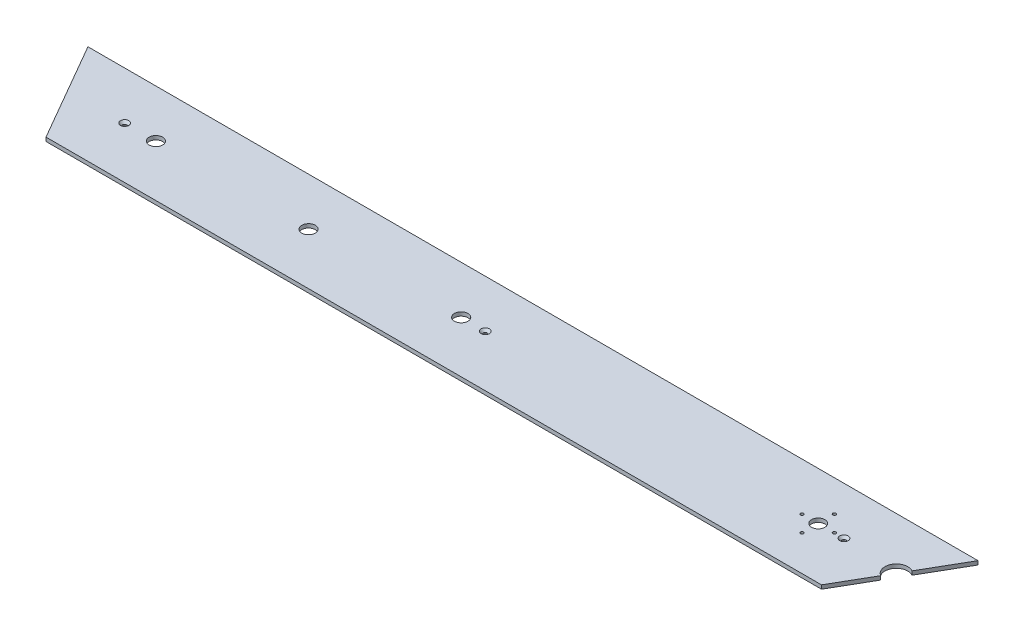
ISO-10303-21;
HEADER;
FILE_DESCRIPTION(('STEP AP214'),'2;1');
FILE_NAME('part.step','',(''),(''),'','','');
FILE_SCHEMA(('AUTOMOTIVE_DESIGN { 1 0 10303 214 1 1 1 1 }'));
ENDSEC;
DATA;
#1=APPLICATION_CONTEXT('core data for automotive mechanical design processes');
#2=APPLICATION_PROTOCOL_DEFINITION('international standard','automotive_design',2000,#1);
#3=PRODUCT_CONTEXT('',#1,'mechanical');
#4=PRODUCT('Part','Part','',(#3));
#5=PRODUCT_RELATED_PRODUCT_CATEGORY('part','',(#4));
#6=PRODUCT_DEFINITION_FORMATION('','',#4);
#7=PRODUCT_DEFINITION_CONTEXT('part definition',#1,'design');
#8=PRODUCT_DEFINITION('design','',#6,#7);
#9=PRODUCT_DEFINITION_SHAPE('','',#8);
#10=(LENGTH_UNIT() NAMED_UNIT(*) SI_UNIT(.MILLI.,.METRE.));
#11=(NAMED_UNIT(*) PLANE_ANGLE_UNIT() SI_UNIT($,.RADIAN.));
#12=(NAMED_UNIT(*) SI_UNIT($,.STERADIAN.) SOLID_ANGLE_UNIT());
#13=UNCERTAINTY_MEASURE_WITH_UNIT(LENGTH_MEASURE(1.E-05),#10,'distance_accuracy_value','');
#14=(GEOMETRIC_REPRESENTATION_CONTEXT(3) GLOBAL_UNCERTAINTY_ASSIGNED_CONTEXT((#13)) GLOBAL_UNIT_ASSIGNED_CONTEXT((#10,
#11,#12)) REPRESENTATION_CONTEXT('',''));
#15=CARTESIAN_POINT('',(0.,0.,0.));
#16=DIRECTION('',(0.,0.,1.));
#17=DIRECTION('',(1.,0.,0.));
#18=AXIS2_PLACEMENT_3D('',#15,#16,#17);
#19=CARTESIAN_POINT('',(-600.075,6.35000000005448,0.));
#20=DIRECTION('',(0.,1.,0.));
#21=DIRECTION('',(-1.,0.,0.));
#22=AXIS2_PLACEMENT_3D('',#19,#20,#21);
#23=CONICAL_SURFACE('',#22,6.97229999997262,0.715584993314902);
#24=CARTESIAN_POINT('',(-600.075,2.20085122883459,0.));
#25=DIRECTION('',(0.,1.,0.));
#26=DIRECTION('',(0.,0.,1.));
#27=AXIS2_PLACEMENT_3D('',#24,#25,#26);
#28=CIRCLE('',#27,3.3655);
#29=CARTESIAN_POINT('',(-600.075,2.20085122883459,3.3655));
#30=VERTEX_POINT('',#29);
#31=EDGE_CURVE('E106',#30,#30,#28,.F.);
#32=ORIENTED_EDGE('',*,*,#31,.T.);
#33=EDGE_LOOP('',(#32));
#34=FACE_BOUND('',#33,.T.);
#35=CARTESIAN_POINT('',(-600.075,6.35000000005448,0.));
#36=DIRECTION('',(0.,1.,0.));
#37=DIRECTION('',(-1.,0.,0.));
#38=AXIS2_PLACEMENT_3D('',#35,#36,#37);
#39=CIRCLE('',#38,6.97229999997262);
#40=CARTESIAN_POINT('',(-607.047299999973,6.35000000005448,0.));
#41=VERTEX_POINT('',#40);
#42=EDGE_CURVE('E19',#41,#41,#39,.F.);
#43=ORIENTED_EDGE('',*,*,#42,.F.);
#44=EDGE_LOOP('',(#43));
#45=FACE_BOUND('',#44,.T.);
#46=ADVANCED_FACE('F16',(#34,#45),#23,.F.);
#47=CARTESIAN_POINT('',(596.9,6.35000000005448,0.));
#48=DIRECTION('',(0.,1.,0.));
#49=DIRECTION('',(-1.,0.,0.));
#50=AXIS2_PLACEMENT_3D('',#47,#48,#49);
#51=CONICAL_SURFACE('',#50,6.97229999997262,0.715584993314902);
#52=CARTESIAN_POINT('',(596.9,2.20085122883459,0.));
#53=DIRECTION('',(0.,1.,0.));
#54=DIRECTION('',(0.,0.,1.));
#55=AXIS2_PLACEMENT_3D('',#52,#53,#54);
#56=CIRCLE('',#55,3.3655);
#57=CARTESIAN_POINT('',(596.9,2.20085122883459,3.3655));
#58=VERTEX_POINT('',#57);
#59=EDGE_CURVE('E102',#58,#58,#56,.F.);
#60=ORIENTED_EDGE('',*,*,#59,.T.);
#61=EDGE_LOOP('',(#60));
#62=FACE_BOUND('',#61,.T.);
#63=CARTESIAN_POINT('',(596.9,6.35000000005448,0.));
#64=DIRECTION('',(0.,1.,0.));
#65=DIRECTION('',(-1.,0.,0.));
#66=AXIS2_PLACEMENT_3D('',#63,#64,#65);
#67=CIRCLE('',#66,6.97229999997262);
#68=CARTESIAN_POINT('',(589.927700000027,6.35000000005448,0.));
#69=VERTEX_POINT('',#68);
#70=EDGE_CURVE('E182',#69,#69,#67,.F.);
#71=ORIENTED_EDGE('',*,*,#70,.F.);
#72=EDGE_LOOP('',(#71));
#73=FACE_BOUND('',#72,.T.);
#74=ADVANCED_FACE('F192',(#62,#73),#51,.F.);
#75=CARTESIAN_POINT('',(0.,6.35,0.));
#76=DIRECTION('',(0.,1.,0.));
#77=DIRECTION('',(0.,0.,1.));
#78=AXIS2_PLACEMENT_3D('',#75,#76,#77);
#79=PLANE('',#78);
#80=CARTESIAN_POINT('',(-548.096896592432,6.35,0.));
#81=DIRECTION('',(0.,1.,0.));
#82=DIRECTION('',(0.,0.,1.));
#83=AXIS2_PLACEMENT_3D('',#80,#81,#82);
#84=CIRCLE('',#83,11.303);
#85=CARTESIAN_POINT('',(-548.096896592432,6.35,11.303));
#86=VERTEX_POINT('',#85);
#87=EDGE_CURVE('E177',#86,#86,#84,.F.);
#88=ORIENTED_EDGE('',*,*,#87,.T.);
#89=EDGE_LOOP('',(#88));
#90=FACE_BOUND('',#89,.T.);
#91=CARTESIAN_POINT('',(581.025,6.35,0.));
#92=DIRECTION('',(0.,1.,0.));
#93=DIRECTION('',(0.,0.,1.));
#94=AXIS2_PLACEMENT_3D('',#91,#92,#93);
#95=CIRCLE('',#94,2.6162);
#96=CARTESIAN_POINT('',(581.025,6.35,2.6162));
#97=VERTEX_POINT('',#96);
#98=EDGE_CURVE('E101',#97,#97,#95,.F.);
#99=ORIENTED_EDGE('',*,*,#98,.T.);
#100=EDGE_LOOP('',(#99));
#101=FACE_BOUND('',#100,.T.);
#102=CARTESIAN_POINT('',(527.05,6.35,0.));
#103=DIRECTION('',(0.,1.,0.));
#104=DIRECTION('',(0.,0.,1.));
#105=AXIS2_PLACEMENT_3D('',#102,#103,#104);
#106=CIRCLE('',#105,2.6162);
#107=CARTESIAN_POINT('',(527.05,6.35,2.6162));
#108=VERTEX_POINT('',#107);
#109=EDGE_CURVE('E161',#108,#108,#106,.F.);
#110=ORIENTED_EDGE('',*,*,#109,.T.);
#111=EDGE_LOOP('',(#110));
#112=FACE_BOUND('',#111,.T.);
#113=CARTESIAN_POINT('',(554.0375,6.35,27.0002));
#114=DIRECTION('',(0.,1.,0.));
#115=DIRECTION('',(0.,0.,1.));
#116=AXIS2_PLACEMENT_3D('',#113,#114,#115);
#117=CIRCLE('',#116,2.6162);
#118=CARTESIAN_POINT('',(554.0375,6.35,29.6164));
#119=VERTEX_POINT('',#118);
#120=EDGE_CURVE('E164',#119,#119,#117,.F.);
#121=ORIENTED_EDGE('',*,*,#120,.T.);
#122=EDGE_LOOP('',(#121));
#123=FACE_BOUND('',#122,.T.);
#124=CARTESIAN_POINT('',(554.0375,6.35,-26.9875));
#125=DIRECTION('',(0.,1.,0.));
#126=DIRECTION('',(0.,0.,1.));
#127=AXIS2_PLACEMENT_3D('',#124,#125,#126);
#128=CIRCLE('',#127,2.6162);
#129=CARTESIAN_POINT('',(554.0375,6.35,-24.3713));
#130=VERTEX_POINT('',#129);
#131=EDGE_CURVE('E167',#130,#130,#128,.F.);
#132=ORIENTED_EDGE('',*,*,#131,.T.);
#133=EDGE_LOOP('',(#132));
#134=FACE_BOUND('',#133,.T.);
#135=CARTESIAN_POINT('',(554.0375,6.35,0.));
#136=DIRECTION('',(0.,1.,0.));
#137=DIRECTION('',(0.,0.,1.));
#138=AXIS2_PLACEMENT_3D('',#135,#136,#137);
#139=CIRCLE('',#138,11.1125);
#140=CARTESIAN_POINT('',(554.0375,6.35,11.1125));
#141=VERTEX_POINT('',#140);
#142=EDGE_CURVE('E105',#141,#141,#139,.F.);
#143=ORIENTED_EDGE('',*,*,#142,.T.);
#144=EDGE_LOOP('',(#143));
#145=FACE_BOUND('',#144,.T.);
#146=ORIENTED_EDGE('',*,*,#70,.T.);
#147=EDGE_LOOP('',(#146));
#148=FACE_BOUND('',#147,.T.);
#149=ORIENTED_EDGE('',*,*,#42,.T.);
#150=EDGE_LOOP('',(#149));
#151=FACE_BOUND('',#150,.T.);
#152=CARTESIAN_POINT('',(0.,6.35000000005448,0.));
#153=DIRECTION('',(0.,1.,0.));
#154=DIRECTION('',(-1.,0.,0.));
#155=AXIS2_PLACEMENT_3D('',#152,#153,#154);
#156=CIRCLE('',#155,6.97229999997262);
#157=CARTESIAN_POINT('',(-6.97229999997262,6.35000000005448,0.));
#158=VERTEX_POINT('',#157);
#159=EDGE_CURVE('E87',#158,#158,#156,.F.);
#160=ORIENTED_EDGE('',*,*,#159,.T.);
#161=EDGE_LOOP('',(#160));
#162=FACE_BOUND('',#161,.T.);
#163=CARTESIAN_POINT('',(-40.096896592432,6.35,0.));
#164=DIRECTION('',(0.,1.,0.));
#165=DIRECTION('',(0.,0.,1.));
#166=AXIS2_PLACEMENT_3D('',#163,#164,#165);
#167=CIRCLE('',#166,11.303);
#168=CARTESIAN_POINT('',(-40.096896592432,6.35,11.303));
#169=VERTEX_POINT('',#168);
#170=EDGE_CURVE('E109',#169,#169,#167,.F.);
#171=ORIENTED_EDGE('',*,*,#170,.T.);
#172=EDGE_LOOP('',(#171));
#173=FACE_BOUND('',#172,.T.);
#174=CARTESIAN_POINT('',(-294.096896592432,6.35,0.));
#175=DIRECTION('',(0.,1.,0.));
#176=DIRECTION('',(0.,0.,1.));
#177=AXIS2_PLACEMENT_3D('',#174,#175,#176);
#178=CIRCLE('',#177,11.303);
#179=CARTESIAN_POINT('',(-294.096896592432,6.35,11.303));
#180=VERTEX_POINT('',#179);
#181=EDGE_CURVE('E174',#180,#180,#178,.F.);
#182=ORIENTED_EDGE('',*,*,#181,.T.);
#183=EDGE_LOOP('',(#182));
#184=FACE_BOUND('',#183,.T.);
#185=DIRECTION('',(0.500000000000017,0.,-0.866025403784429));
#186=VECTOR('',#185,1.);
#187=CARTESIAN_POINT('',(645.263144766024,6.35,85.725));
#188=LINE('',#187,#186);
#189=CARTESIAN_POINT('',(681.345351930393,6.35,23.2287839420901));
#190=VERTEX_POINT('',#189);
#191=CARTESIAN_POINT('',(645.263144766024,6.35,85.725));
#192=VERTEX_POINT('',#191);
#193=EDGE_CURVE('E83',#190,#192,#188,.F.);
#194=ORIENTED_EDGE('',*,*,#193,.F.);
#195=CARTESIAN_POINT('',(690.870351930396,6.35,6.731));
#196=DIRECTION('',(0.,1.,0.));
#197=DIRECTION('',(0.,0.,1.));
#198=AXIS2_PLACEMENT_3D('',#195,#196,#197);
#199=CIRCLE('',#198,19.05);
#200=CARTESIAN_POINT('',(700.395351930393,6.35,-9.76678394209511));
#201=VERTEX_POINT('',#200);
#202=EDGE_CURVE('E77',#190,#201,#199,.F.);
#203=ORIENTED_EDGE('',*,*,#202,.T.);
#204=DIRECTION('',(0.500000000000017,0.,-0.866025403784429));
#205=VECTOR('',#204,1.);
#206=CARTESIAN_POINT('',(645.263144766024,6.35,85.725));
#207=LINE('',#206,#205);
#208=CARTESIAN_POINT('',(740.583674209374,6.35,-79.3750000000266));
#209=VERTEX_POINT('',#208);
#210=EDGE_CURVE('E67',#209,#201,#207,.F.);
#211=ORIENTED_EDGE('',*,*,#210,.F.);
#212=DIRECTION('',(-1.,0.,0.));
#213=VECTOR('',#212,1.);
#214=CARTESIAN_POINT('',(740.58367420942,6.35,-79.375));
#215=LINE('',#214,#213);
#216=CARTESIAN_POINT('',(-740.58367420942,6.35,-79.375));
#217=VERTEX_POINT('',#216);
#218=EDGE_CURVE('E91',#217,#209,#215,.F.);
#219=ORIENTED_EDGE('',*,*,#218,.F.);
#220=DIRECTION('',(0.500000000000017,0.,0.866025403784429));
#221=VECTOR('',#220,1.);
#222=CARTESIAN_POINT('',(-740.58367420942,6.35,-79.375));
#223=LINE('',#222,#221);
#224=CARTESIAN_POINT('',(-645.26314476607,6.35,85.7250000000266));
#225=VERTEX_POINT('',#224);
#226=EDGE_CURVE('E119',#225,#217,#223,.F.);
#227=ORIENTED_EDGE('',*,*,#226,.F.);
#228=DIRECTION('',(1.,0.,0.));
#229=VECTOR('',#228,1.);
#230=CARTESIAN_POINT('',(-645.263144766024,6.35,85.725));
#231=LINE('',#230,#229);
#232=EDGE_CURVE('E114',#192,#225,#231,.F.);
#233=ORIENTED_EDGE('',*,*,#232,.F.);
#234=EDGE_LOOP('',(#194,#203,#211,#219,#227,#233));
#235=FACE_BOUND('',#234,.T.);
#236=ADVANCED_FACE('F81',(#90,#101,#112,#123,#134,#145,#148,#151,#162,#173,#184,#235),#79,.T.);
#237=CARTESIAN_POINT('',(0.,6.35000000005448,0.));
#238=DIRECTION('',(0.,1.,0.));
#239=DIRECTION('',(-1.,0.,0.));
#240=AXIS2_PLACEMENT_3D('',#237,#238,#239);
#241=CONICAL_SURFACE('',#240,6.97229999997262,0.715584993314902);
#242=CARTESIAN_POINT('',(0.,2.20085122883459,0.));
#243=DIRECTION('',(0.,1.,0.));
#244=DIRECTION('',(0.,0.,1.));
#245=AXIS2_PLACEMENT_3D('',#242,#243,#244);
#246=CIRCLE('',#245,3.3655);
#247=CARTESIAN_POINT('',(0.,2.20085122883459,3.3655));
#248=VERTEX_POINT('',#247);
#249=EDGE_CURVE('E98',#248,#248,#246,.F.);
#250=ORIENTED_EDGE('',*,*,#249,.T.);
#251=EDGE_LOOP('',(#250));
#252=FACE_BOUND('',#251,.T.);
#253=ORIENTED_EDGE('',*,*,#159,.F.);
#254=EDGE_LOOP('',(#253));
#255=FACE_BOUND('',#254,.T.);
#256=ADVANCED_FACE('F271',(#252,#255),#241,.F.);
#257=CARTESIAN_POINT('',(690.870351930396,6.35,6.731));
#258=DIRECTION('',(0.,1.,0.));
#259=DIRECTION('',(0.,0.,1.));
#260=AXIS2_PLACEMENT_3D('',#257,#258,#259);
#261=CYLINDRICAL_SURFACE('',#260,19.05);
#262=ORIENTED_EDGE('',*,*,#202,.F.);
#263=DIRECTION('',(0.,1.,0.));
#264=VECTOR('',#263,1.);
#265=CARTESIAN_POINT('',(681.345351930394,0.,23.2287839420889));
#266=LINE('',#265,#264);
#267=CARTESIAN_POINT('',(681.345351930394,0.,23.2287839420908));
#268=VERTEX_POINT('',#267);
#269=EDGE_CURVE('E179',#268,#190,#266,.T.);
#270=ORIENTED_EDGE('',*,*,#269,.F.);
#271=CARTESIAN_POINT('',(690.870351930396,0.,6.731));
#272=DIRECTION('',(0.,1.,0.));
#273=DIRECTION('',(0.,0.,1.));
#274=AXIS2_PLACEMENT_3D('',#271,#272,#273);
#275=CIRCLE('',#274,19.05);
#276=CARTESIAN_POINT('',(700.395351930394,0.,-9.76678394209411));
#277=VERTEX_POINT('',#276);
#278=EDGE_CURVE('E90',#268,#277,#275,.F.);
#279=ORIENTED_EDGE('',*,*,#278,.T.);
#280=DIRECTION('',(0.,1.,0.));
#281=VECTOR('',#280,1.);
#282=CARTESIAN_POINT('',(700.395351930393,0.,-9.76678394209485));
#283=LINE('',#282,#281);
#284=EDGE_CURVE('E72',#201,#277,#283,.F.);
#285=ORIENTED_EDGE('',*,*,#284,.F.);
#286=EDGE_LOOP('',(#262,#270,#279,#285));
#287=FACE_BOUND('',#286,.T.);
#288=ADVANCED_FACE('F89',(#287),#261,.F.);
#289=CARTESIAN_POINT('',(645.263144766024,0.,85.725));
#290=DIRECTION('',(0.866025403784429,0.,0.500000000000017));
#291=DIRECTION('',(0.500000000000017,0.,-0.866025403784429));
#292=AXIS2_PLACEMENT_3D('',#289,#290,#291);
#293=PLANE('',#292);
#294=ORIENTED_EDGE('',*,*,#210,.T.);
#295=ORIENTED_EDGE('',*,*,#284,.T.);
#296=DIRECTION('',(0.500000000001559,0.,-0.866025403783539));
#297=VECTOR('',#296,1.);
#298=CARTESIAN_POINT('',(700.395351930396,0.,-9.76678394209282));
#299=LINE('',#298,#297);
#300=CARTESIAN_POINT('',(740.58367420942,0.,-79.3750000000169));
#301=VERTEX_POINT('',#300);
#302=EDGE_CURVE('E158',#277,#301,#299,.T.);
#303=ORIENTED_EDGE('',*,*,#302,.T.);
#304=DIRECTION('',(0.,1.,0.));
#305=VECTOR('',#304,1.);
#306=CARTESIAN_POINT('',(740.58367420942,0.,-79.375));
#307=LINE('',#306,#305);
#308=EDGE_CURVE('E74',#209,#301,#307,.F.);
#309=ORIENTED_EDGE('',*,*,#308,.F.);
#310=EDGE_LOOP('',(#294,#295,#303,#309));
#311=FACE_BOUND('',#310,.T.);
#312=ADVANCED_FACE('F69',(#311),#293,.T.);
#313=CARTESIAN_POINT('',(740.58367420942,0.,-79.375));
#314=DIRECTION('',(0.,0.,-1.));
#315=DIRECTION('',(-1.,0.,0.));
#316=AXIS2_PLACEMENT_3D('',#313,#314,#315);
#317=PLANE('',#316);
#318=ORIENTED_EDGE('',*,*,#308,.T.);
#319=DIRECTION('',(1.,0.,0.));
#320=VECTOR('',#319,1.);
#321=CARTESIAN_POINT('',(0.,0.,-79.3750000000254));
#322=LINE('',#321,#320);
#323=CARTESIAN_POINT('',(-740.58367420943,0.,-79.3750000000169));
#324=VERTEX_POINT('',#323);
#325=EDGE_CURVE('E315',#301,#324,#322,.F.);
#326=ORIENTED_EDGE('',*,*,#325,.T.);
#327=DIRECTION('',(0.,1.,0.));
#328=VECTOR('',#327,1.);
#329=CARTESIAN_POINT('',(-740.58367420942,0.,-79.375));
#330=LINE('',#329,#328);
#331=EDGE_CURVE('E116',#217,#324,#330,.F.);
#332=ORIENTED_EDGE('',*,*,#331,.F.);
#333=ORIENTED_EDGE('',*,*,#218,.T.);
#334=EDGE_LOOP('',(#318,#326,#332,#333));
#335=FACE_BOUND('',#334,.T.);
#336=ADVANCED_FACE('F262',(#335),#317,.T.);
#337=CARTESIAN_POINT('',(-740.58367420942,0.,-79.375));
#338=DIRECTION('',(-0.866025403784429,0.,0.500000000000017));
#339=DIRECTION('',(0.500000000000017,0.,0.866025403784429));
#340=AXIS2_PLACEMENT_3D('',#337,#338,#339);
#341=PLANE('',#340);
#342=ORIENTED_EDGE('',*,*,#331,.T.);
#343=DIRECTION('',(0.500000000000685,0.,0.866025403784043));
#344=VECTOR('',#343,1.);
#345=CARTESIAN_POINT('',(-740.58367420942,0.,-79.375));
#346=LINE('',#345,#344);
#347=CARTESIAN_POINT('',(-645.263144766024,0.,85.7250000000169));
#348=VERTEX_POINT('',#347);
#349=EDGE_CURVE('E310',#324,#348,#346,.T.);
#350=ORIENTED_EDGE('',*,*,#349,.T.);
#351=DIRECTION('',(0.,1.,0.));
#352=VECTOR('',#351,1.);
#353=CARTESIAN_POINT('',(-645.263144766024,0.,85.725));
#354=LINE('',#353,#352);
#355=EDGE_CURVE('E111',#225,#348,#354,.F.);
#356=ORIENTED_EDGE('',*,*,#355,.F.);
#357=ORIENTED_EDGE('',*,*,#226,.T.);
#358=EDGE_LOOP('',(#342,#350,#356,#357));
#359=FACE_BOUND('',#358,.T.);
#360=ADVANCED_FACE('F258',(#359),#341,.T.);
#361=CARTESIAN_POINT('',(-645.263144766024,0.,85.725));
#362=DIRECTION('',(0.,0.,1.));
#363=DIRECTION('',(1.,0.,0.));
#364=AXIS2_PLACEMENT_3D('',#361,#362,#363);
#365=PLANE('',#364);
#366=ORIENTED_EDGE('',*,*,#355,.T.);
#367=DIRECTION('',(1.,0.,0.));
#368=VECTOR('',#367,1.);
#369=CARTESIAN_POINT('',(0.,0.,85.7250000000254));
#370=LINE('',#369,#368);
#371=CARTESIAN_POINT('',(645.263144766014,0.,85.7250000000169));
#372=VERTEX_POINT('',#371);
#373=EDGE_CURVE('E307',#348,#372,#370,.T.);
#374=ORIENTED_EDGE('',*,*,#373,.T.);
#375=DIRECTION('',(0.,1.,0.));
#376=VECTOR('',#375,1.);
#377=CARTESIAN_POINT('',(645.263144766024,0.,85.725));
#378=LINE('',#377,#376);
#379=EDGE_CURVE('E34',#192,#372,#378,.F.);
#380=ORIENTED_EDGE('',*,*,#379,.F.);
#381=ORIENTED_EDGE('',*,*,#232,.T.);
#382=EDGE_LOOP('',(#366,#374,#380,#381));
#383=FACE_BOUND('',#382,.T.);
#384=ADVANCED_FACE('F255',(#383),#365,.T.);
#385=CARTESIAN_POINT('',(645.263144766024,0.,85.725));
#386=DIRECTION('',(0.866025403784429,0.,0.500000000000017));
#387=DIRECTION('',(0.500000000000017,0.,-0.866025403784429));
#388=AXIS2_PLACEMENT_3D('',#385,#386,#387);
#389=PLANE('',#388);
#390=DIRECTION('',(0.500000000000049,0.,-0.86602540378441));
#391=VECTOR('',#390,1.);
#392=CARTESIAN_POINT('',(645.263144766024,0.,85.725));
#393=LINE('',#392,#391);
#394=EDGE_CURVE('E156',#372,#268,#393,.T.);
#395=ORIENTED_EDGE('',*,*,#394,.T.);
#396=ORIENTED_EDGE('',*,*,#269,.T.);
#397=ORIENTED_EDGE('',*,*,#193,.T.);
#398=ORIENTED_EDGE('',*,*,#379,.T.);
#399=EDGE_LOOP('',(#395,#396,#397,#398));
#400=FACE_BOUND('',#399,.T.);
#401=ADVANCED_FACE('F251',(#400),#389,.T.);
#402=CARTESIAN_POINT('',(-548.096896592432,6.35,0.));
#403=DIRECTION('',(0.,1.,0.));
#404=DIRECTION('',(0.,0.,1.));
#405=AXIS2_PLACEMENT_3D('',#402,#403,#404);
#406=CYLINDRICAL_SURFACE('',#405,11.303);
#407=ORIENTED_EDGE('',*,*,#87,.F.);
#408=EDGE_LOOP('',(#407));
#409=FACE_BOUND('',#408,.T.);
#410=CARTESIAN_POINT('',(-548.096896592432,0.,0.));
#411=DIRECTION('',(0.,1.,0.));
#412=DIRECTION('',(0.,0.,1.));
#413=AXIS2_PLACEMENT_3D('',#410,#411,#412);
#414=CIRCLE('',#413,11.303);
#415=CARTESIAN_POINT('',(-548.096896592432,0.,11.303));
#416=VERTEX_POINT('',#415);
#417=EDGE_CURVE('E153',#416,#416,#414,.F.);
#418=ORIENTED_EDGE('',*,*,#417,.T.);
#419=EDGE_LOOP('',(#418));
#420=FACE_BOUND('',#419,.T.);
#421=ADVANCED_FACE('F247',(#409,#420),#406,.F.);
#422=CARTESIAN_POINT('',(-294.096896592432,6.35,0.));
#423=DIRECTION('',(0.,1.,0.));
#424=DIRECTION('',(0.,0.,1.));
#425=AXIS2_PLACEMENT_3D('',#422,#423,#424);
#426=CYLINDRICAL_SURFACE('',#425,11.303);
#427=ORIENTED_EDGE('',*,*,#181,.F.);
#428=EDGE_LOOP('',(#427));
#429=FACE_BOUND('',#428,.T.);
#430=CARTESIAN_POINT('',(-294.096896592432,0.,0.));
#431=DIRECTION('',(0.,1.,0.));
#432=DIRECTION('',(0.,0.,1.));
#433=AXIS2_PLACEMENT_3D('',#430,#431,#432);
#434=CIRCLE('',#433,11.303);
#435=CARTESIAN_POINT('',(-294.096896592432,0.,11.303));
#436=VERTEX_POINT('',#435);
#437=EDGE_CURVE('E150',#436,#436,#434,.F.);
#438=ORIENTED_EDGE('',*,*,#437,.T.);
#439=EDGE_LOOP('',(#438));
#440=FACE_BOUND('',#439,.T.);
#441=ADVANCED_FACE('F243',(#429,#440),#426,.F.);
#442=CARTESIAN_POINT('',(-40.096896592432,6.35,0.));
#443=DIRECTION('',(0.,1.,0.));
#444=DIRECTION('',(0.,0.,1.));
#445=AXIS2_PLACEMENT_3D('',#442,#443,#444);
#446=CYLINDRICAL_SURFACE('',#445,11.303);
#447=ORIENTED_EDGE('',*,*,#170,.F.);
#448=EDGE_LOOP('',(#447));
#449=FACE_BOUND('',#448,.T.);
#450=CARTESIAN_POINT('',(-40.096896592432,0.,0.));
#451=DIRECTION('',(0.,1.,0.));
#452=DIRECTION('',(0.,0.,1.));
#453=AXIS2_PLACEMENT_3D('',#450,#451,#452);
#454=CIRCLE('',#453,11.303);
#455=CARTESIAN_POINT('',(-40.096896592432,0.,11.303));
#456=VERTEX_POINT('',#455);
#457=EDGE_CURVE('E147',#456,#456,#454,.F.);
#458=ORIENTED_EDGE('',*,*,#457,.T.);
#459=EDGE_LOOP('',(#458));
#460=FACE_BOUND('',#459,.T.);
#461=ADVANCED_FACE('F239',(#449,#460),#446,.F.);
#462=CARTESIAN_POINT('',(-600.075,6.35,0.));
#463=DIRECTION('',(0.,1.,0.));
#464=DIRECTION('',(0.,0.,1.));
#465=AXIS2_PLACEMENT_3D('',#462,#463,#464);
#466=CYLINDRICAL_SURFACE('',#465,3.3655);
#467=CARTESIAN_POINT('',(-600.075,0.,0.));
#468=DIRECTION('',(0.,1.,0.));
#469=DIRECTION('',(0.,0.,1.));
#470=AXIS2_PLACEMENT_3D('',#467,#468,#469);
#471=CIRCLE('',#470,3.3655);
#472=CARTESIAN_POINT('',(-600.075,0.,3.3655));
#473=VERTEX_POINT('',#472);
#474=EDGE_CURVE('E144',#473,#473,#471,.F.);
#475=ORIENTED_EDGE('',*,*,#474,.T.);
#476=EDGE_LOOP('',(#475));
#477=FACE_BOUND('',#476,.T.);
#478=ORIENTED_EDGE('',*,*,#31,.F.);
#479=EDGE_LOOP('',(#478));
#480=FACE_BOUND('',#479,.T.);
#481=ADVANCED_FACE('F235',(#477,#480),#466,.F.);
#482=CARTESIAN_POINT('',(596.9,6.35,0.));
#483=DIRECTION('',(0.,1.,0.));
#484=DIRECTION('',(0.,0.,1.));
#485=AXIS2_PLACEMENT_3D('',#482,#483,#484);
#486=CYLINDRICAL_SURFACE('',#485,3.3655);
#487=CARTESIAN_POINT('',(596.9,0.,0.));
#488=DIRECTION('',(0.,1.,0.));
#489=DIRECTION('',(0.,0.,1.));
#490=AXIS2_PLACEMENT_3D('',#487,#488,#489);
#491=CIRCLE('',#490,3.3655);
#492=CARTESIAN_POINT('',(596.9,0.,3.3655));
#493=VERTEX_POINT('',#492);
#494=EDGE_CURVE('E141',#493,#493,#491,.F.);
#495=ORIENTED_EDGE('',*,*,#494,.T.);
#496=EDGE_LOOP('',(#495));
#497=FACE_BOUND('',#496,.T.);
#498=ORIENTED_EDGE('',*,*,#59,.F.);
#499=EDGE_LOOP('',(#498));
#500=FACE_BOUND('',#499,.T.);
#501=ADVANCED_FACE('F231',(#497,#500),#486,.F.);
#502=CARTESIAN_POINT('',(554.0375,6.35,0.));
#503=DIRECTION('',(0.,1.,0.));
#504=DIRECTION('',(0.,0.,1.));
#505=AXIS2_PLACEMENT_3D('',#502,#503,#504);
#506=CYLINDRICAL_SURFACE('',#505,11.1125);
#507=ORIENTED_EDGE('',*,*,#142,.F.);
#508=EDGE_LOOP('',(#507));
#509=FACE_BOUND('',#508,.T.);
#510=CARTESIAN_POINT('',(554.0375,0.,0.));
#511=DIRECTION('',(0.,1.,0.));
#512=DIRECTION('',(0.,0.,1.));
#513=AXIS2_PLACEMENT_3D('',#510,#511,#512);
#514=CIRCLE('',#513,11.1125);
#515=CARTESIAN_POINT('',(554.0375,0.,11.1125));
#516=VERTEX_POINT('',#515);
#517=EDGE_CURVE('E138',#516,#516,#514,.F.);
#518=ORIENTED_EDGE('',*,*,#517,.T.);
#519=EDGE_LOOP('',(#518));
#520=FACE_BOUND('',#519,.T.);
#521=ADVANCED_FACE('F227',(#509,#520),#506,.F.);
#522=CARTESIAN_POINT('',(554.0375,6.35,-26.9875));
#523=DIRECTION('',(0.,1.,0.));
#524=DIRECTION('',(0.,0.,1.));
#525=AXIS2_PLACEMENT_3D('',#522,#523,#524);
#526=CYLINDRICAL_SURFACE('',#525,2.6162);
#527=ORIENTED_EDGE('',*,*,#131,.F.);
#528=EDGE_LOOP('',(#527));
#529=FACE_BOUND('',#528,.T.);
#530=CARTESIAN_POINT('',(554.0375,0.,-26.9875));
#531=DIRECTION('',(0.,1.,0.));
#532=DIRECTION('',(0.,0.,1.));
#533=AXIS2_PLACEMENT_3D('',#530,#531,#532);
#534=CIRCLE('',#533,2.6162);
#535=CARTESIAN_POINT('',(554.0375,0.,-24.3713));
#536=VERTEX_POINT('',#535);
#537=EDGE_CURVE('E135',#536,#536,#534,.F.);
#538=ORIENTED_EDGE('',*,*,#537,.T.);
#539=EDGE_LOOP('',(#538));
#540=FACE_BOUND('',#539,.T.);
#541=ADVANCED_FACE('F223',(#529,#540),#526,.F.);
#542=CARTESIAN_POINT('',(554.0375,6.35,27.0002));
#543=DIRECTION('',(0.,1.,0.));
#544=DIRECTION('',(0.,0.,1.));
#545=AXIS2_PLACEMENT_3D('',#542,#543,#544);
#546=CYLINDRICAL_SURFACE('',#545,2.6162);
#547=ORIENTED_EDGE('',*,*,#120,.F.);
#548=EDGE_LOOP('',(#547));
#549=FACE_BOUND('',#548,.T.);
#550=CARTESIAN_POINT('',(554.0375,0.,27.0002));
#551=DIRECTION('',(0.,1.,0.));
#552=DIRECTION('',(0.,0.,1.));
#553=AXIS2_PLACEMENT_3D('',#550,#551,#552);
#554=CIRCLE('',#553,2.6162);
#555=CARTESIAN_POINT('',(554.0375,0.,29.6164));
#556=VERTEX_POINT('',#555);
#557=EDGE_CURVE('E132',#556,#556,#554,.F.);
#558=ORIENTED_EDGE('',*,*,#557,.T.);
#559=EDGE_LOOP('',(#558));
#560=FACE_BOUND('',#559,.T.);
#561=ADVANCED_FACE('F219',(#549,#560),#546,.F.);
#562=CARTESIAN_POINT('',(527.05,6.35,0.));
#563=DIRECTION('',(0.,1.,0.));
#564=DIRECTION('',(0.,0.,1.));
#565=AXIS2_PLACEMENT_3D('',#562,#563,#564);
#566=CYLINDRICAL_SURFACE('',#565,2.6162);
#567=ORIENTED_EDGE('',*,*,#109,.F.);
#568=EDGE_LOOP('',(#567));
#569=FACE_BOUND('',#568,.T.);
#570=CARTESIAN_POINT('',(527.05,0.,0.));
#571=DIRECTION('',(0.,1.,0.));
#572=DIRECTION('',(0.,0.,1.));
#573=AXIS2_PLACEMENT_3D('',#570,#571,#572);
#574=CIRCLE('',#573,2.6162);
#575=CARTESIAN_POINT('',(527.05,0.,2.6162));
#576=VERTEX_POINT('',#575);
#577=EDGE_CURVE('E129',#576,#576,#574,.F.);
#578=ORIENTED_EDGE('',*,*,#577,.T.);
#579=EDGE_LOOP('',(#578));
#580=FACE_BOUND('',#579,.T.);
#581=ADVANCED_FACE('F215',(#569,#580),#566,.F.);
#582=CARTESIAN_POINT('',(581.025,6.35,0.));
#583=DIRECTION('',(0.,1.,0.));
#584=DIRECTION('',(0.,0.,1.));
#585=AXIS2_PLACEMENT_3D('',#582,#583,#584);
#586=CYLINDRICAL_SURFACE('',#585,2.6162);
#587=ORIENTED_EDGE('',*,*,#98,.F.);
#588=EDGE_LOOP('',(#587));
#589=FACE_BOUND('',#588,.T.);
#590=CARTESIAN_POINT('',(581.025,0.,0.));
#591=DIRECTION('',(0.,1.,0.));
#592=DIRECTION('',(0.,0.,1.));
#593=AXIS2_PLACEMENT_3D('',#590,#591,#592);
#594=CIRCLE('',#593,2.6162);
#595=CARTESIAN_POINT('',(581.025,0.,2.6162));
#596=VERTEX_POINT('',#595);
#597=EDGE_CURVE('E25',#596,#596,#594,.F.);
#598=ORIENTED_EDGE('',*,*,#597,.T.);
#599=EDGE_LOOP('',(#598));
#600=FACE_BOUND('',#599,.T.);
#601=ADVANCED_FACE('F207',(#589,#600),#586,.F.);
#602=CARTESIAN_POINT('',(0.,6.35,0.));
#603=DIRECTION('',(0.,1.,0.));
#604=DIRECTION('',(0.,0.,1.));
#605=AXIS2_PLACEMENT_3D('',#602,#603,#604);
#606=CYLINDRICAL_SURFACE('',#605,3.3655);
#607=CARTESIAN_POINT('',(0.,0.,0.));
#608=DIRECTION('',(0.,1.,0.));
#609=DIRECTION('',(0.,0.,1.));
#610=AXIS2_PLACEMENT_3D('',#607,#608,#609);
#611=CIRCLE('',#610,3.3655);
#612=CARTESIAN_POINT('',(0.,0.,3.3655));
#613=VERTEX_POINT('',#612);
#614=EDGE_CURVE('E11',#613,#613,#611,.F.);
#615=ORIENTED_EDGE('',*,*,#614,.T.);
#616=EDGE_LOOP('',(#615));
#617=FACE_BOUND('',#616,.T.);
#618=ORIENTED_EDGE('',*,*,#249,.F.);
#619=EDGE_LOOP('',(#618));
#620=FACE_BOUND('',#619,.T.);
#621=ADVANCED_FACE('F201',(#617,#620),#606,.F.);
#622=CARTESIAN_POINT('',(0.,0.,0.));
#623=DIRECTION('',(0.,1.,0.));
#624=DIRECTION('',(0.,0.,1.));
#625=AXIS2_PLACEMENT_3D('',#622,#623,#624);
#626=PLANE('',#625);
#627=ORIENTED_EDGE('',*,*,#614,.F.);
#628=EDGE_LOOP('',(#627));
#629=FACE_BOUND('',#628,.T.);
#630=ORIENTED_EDGE('',*,*,#597,.F.);
#631=EDGE_LOOP('',(#630));
#632=FACE_BOUND('',#631,.T.);
#633=ORIENTED_EDGE('',*,*,#577,.F.);
#634=EDGE_LOOP('',(#633));
#635=FACE_BOUND('',#634,.T.);
#636=ORIENTED_EDGE('',*,*,#557,.F.);
#637=EDGE_LOOP('',(#636));
#638=FACE_BOUND('',#637,.T.);
#639=ORIENTED_EDGE('',*,*,#537,.F.);
#640=EDGE_LOOP('',(#639));
#641=FACE_BOUND('',#640,.T.);
#642=ORIENTED_EDGE('',*,*,#517,.F.);
#643=EDGE_LOOP('',(#642));
#644=FACE_BOUND('',#643,.T.);
#645=ORIENTED_EDGE('',*,*,#494,.F.);
#646=EDGE_LOOP('',(#645));
#647=FACE_BOUND('',#646,.T.);
#648=ORIENTED_EDGE('',*,*,#474,.F.);
#649=EDGE_LOOP('',(#648));
#650=FACE_BOUND('',#649,.T.);
#651=ORIENTED_EDGE('',*,*,#457,.F.);
#652=EDGE_LOOP('',(#651));
#653=FACE_BOUND('',#652,.T.);
#654=ORIENTED_EDGE('',*,*,#437,.F.);
#655=EDGE_LOOP('',(#654));
#656=FACE_BOUND('',#655,.T.);
#657=ORIENTED_EDGE('',*,*,#417,.F.);
#658=EDGE_LOOP('',(#657));
#659=FACE_BOUND('',#658,.T.);
#660=ORIENTED_EDGE('',*,*,#373,.F.);
#661=ORIENTED_EDGE('',*,*,#349,.F.);
#662=ORIENTED_EDGE('',*,*,#325,.F.);
#663=ORIENTED_EDGE('',*,*,#302,.F.);
#664=ORIENTED_EDGE('',*,*,#278,.F.);
#665=ORIENTED_EDGE('',*,*,#394,.F.);
#666=EDGE_LOOP('',(#660,#661,#662,#663,#664,#665));
#667=FACE_BOUND('',#666,.T.);
#668=ADVANCED_FACE('F199',(#629,#632,#635,#638,#641,#644,#647,#650,#653,#656,#659,#667),#626,.F.);
#669=CLOSED_SHELL('',(#46,#74,#236,#256,#288,#312,#336,#360,#384,#401,#421,#441,#461,#481,#501,
#521,#541,#561,#581,#601,#621,#668));
#670=MANIFOLD_SOLID_BREP('B1',#669);
#671=ADVANCED_BREP_SHAPE_REPRESENTATION('',(#18,#670),#14);
#672=SHAPE_DEFINITION_REPRESENTATION(#9,#671);
ENDSEC;
END-ISO-10303-21;
